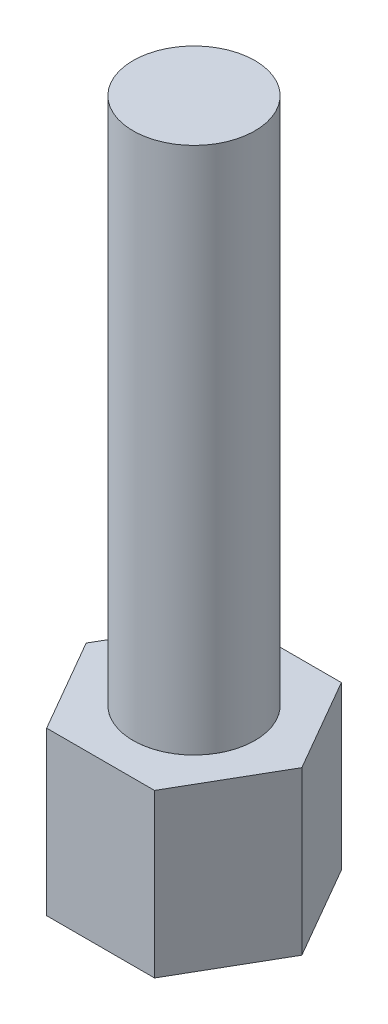
ISO-10303-21;
HEADER;
FILE_DESCRIPTION(('STEP AP214'),'2;1');
FILE_NAME('part.step','',(''),(''),'','','');
FILE_SCHEMA(('AUTOMOTIVE_DESIGN { 1 0 10303 214 1 1 1 1 }'));
ENDSEC;
DATA;
#1=APPLICATION_CONTEXT('core data for automotive mechanical design processes');
#2=APPLICATION_PROTOCOL_DEFINITION('international standard','automotive_design',2000,#1);
#3=PRODUCT_CONTEXT('',#1,'mechanical');
#4=PRODUCT('Part','Part','',(#3));
#5=PRODUCT_RELATED_PRODUCT_CATEGORY('part','',(#4));
#6=PRODUCT_DEFINITION_FORMATION('','',#4);
#7=PRODUCT_DEFINITION_CONTEXT('part definition',#1,'design');
#8=PRODUCT_DEFINITION('design','',#6,#7);
#9=PRODUCT_DEFINITION_SHAPE('','',#8);
#10=(LENGTH_UNIT() NAMED_UNIT(*) SI_UNIT(.MILLI.,.METRE.));
#11=(NAMED_UNIT(*) PLANE_ANGLE_UNIT() SI_UNIT($,.RADIAN.));
#12=(NAMED_UNIT(*) SI_UNIT($,.STERADIAN.) SOLID_ANGLE_UNIT());
#13=UNCERTAINTY_MEASURE_WITH_UNIT(LENGTH_MEASURE(1.E-05),#10,'distance_accuracy_value','');
#14=(GEOMETRIC_REPRESENTATION_CONTEXT(3) GLOBAL_UNCERTAINTY_ASSIGNED_CONTEXT((#13)) GLOBAL_UNIT_ASSIGNED_CONTEXT((#10,
#11,#12)) REPRESENTATION_CONTEXT('',''));
#15=CARTESIAN_POINT('',(0.,0.,0.));
#16=DIRECTION('',(0.,0.,1.));
#17=DIRECTION('',(1.,0.,0.));
#18=AXIS2_PLACEMENT_3D('',#15,#16,#17);
#19=CARTESIAN_POINT('',(1.32790561913614,4.,-2.3));
#20=DIRECTION('',(0.,0.,1.));
#21=DIRECTION('',(1.,0.,0.));
#22=AXIS2_PLACEMENT_3D('',#19,#20,#21);
#23=PLANE('',#22);
#24=DIRECTION('',(-1.,0.,0.));
#25=VECTOR('',#24,1.);
#26=CARTESIAN_POINT('',(1.32790561913614,0.,-2.3));
#27=LINE('',#26,#25);
#28=CARTESIAN_POINT('',(1.32790561913614,0.,-2.3));
#29=VERTEX_POINT('',#28);
#30=CARTESIAN_POINT('',(-1.32790561913614,0.,-2.3));
#31=VERTEX_POINT('',#30);
#32=EDGE_CURVE('E139',#29,#31,#27,.T.);
#33=ORIENTED_EDGE('',*,*,#32,.T.);
#34=DIRECTION('',(0.,-1.,0.));
#35=VECTOR('',#34,1.);
#36=CARTESIAN_POINT('',(-1.32790561913614,4.,-2.3));
#37=LINE('',#36,#35);
#38=CARTESIAN_POINT('',(-1.32790561913614,4.,-2.3));
#39=VERTEX_POINT('',#38);
#40=EDGE_CURVE('E123',#39,#31,#37,.T.);
#41=ORIENTED_EDGE('',*,*,#40,.F.);
#42=DIRECTION('',(-1.,0.,0.));
#43=VECTOR('',#42,1.);
#44=CARTESIAN_POINT('',(1.32790561913614,4.,-2.3));
#45=LINE('',#44,#43);
#46=CARTESIAN_POINT('',(1.32790561913614,4.,-2.3));
#47=VERTEX_POINT('',#46);
#48=EDGE_CURVE('E148',#47,#39,#45,.T.);
#49=ORIENTED_EDGE('',*,*,#48,.F.);
#50=DIRECTION('',(0.,-1.,0.));
#51=VECTOR('',#50,1.);
#52=CARTESIAN_POINT('',(1.32790561913614,4.,-2.3));
#53=LINE('',#52,#51);
#54=EDGE_CURVE('E125',#47,#29,#53,.T.);
#55=ORIENTED_EDGE('',*,*,#54,.T.);
#56=EDGE_LOOP('',(#33,#41,#49,#55));
#57=FACE_BOUND('',#56,.T.);
#58=ADVANCED_FACE('F55',(#57),#23,.F.);
#59=CARTESIAN_POINT('',(-1.32790561913614,4.,-2.3));
#60=DIRECTION('',(0.866025403784439,0.,0.499999999999999));
#61=DIRECTION('',(0.499999999999999,0.,-0.866025403784439));
#62=AXIS2_PLACEMENT_3D('',#59,#60,#61);
#63=PLANE('',#62);
#64=DIRECTION('',(-0.5,0.,0.866025403784439));
#65=VECTOR('',#64,1.);
#66=CARTESIAN_POINT('',(-1.32790561913614,0.,-2.3));
#67=LINE('',#66,#65);
#68=CARTESIAN_POINT('',(-2.65581123827228,0.,0.));
#69=VERTEX_POINT('',#68);
#70=EDGE_CURVE('E73',#31,#69,#67,.T.);
#71=ORIENTED_EDGE('',*,*,#70,.T.);
#72=DIRECTION('',(0.,-1.,0.));
#73=VECTOR('',#72,1.);
#74=CARTESIAN_POINT('',(-2.65581123827228,4.,0.));
#75=LINE('',#74,#73);
#76=CARTESIAN_POINT('',(-2.65581123827228,4.,0.));
#77=VERTEX_POINT('',#76);
#78=EDGE_CURVE('E120',#77,#69,#75,.T.);
#79=ORIENTED_EDGE('',*,*,#78,.F.);
#80=DIRECTION('',(-0.5,0.,0.866025403784439));
#81=VECTOR('',#80,1.);
#82=CARTESIAN_POINT('',(-1.32790561913614,4.,-2.3));
#83=LINE('',#82,#81);
#84=EDGE_CURVE('E95',#39,#77,#83,.T.);
#85=ORIENTED_EDGE('',*,*,#84,.F.);
#86=ORIENTED_EDGE('',*,*,#40,.T.);
#87=EDGE_LOOP('',(#71,#79,#85,#86));
#88=FACE_BOUND('',#87,.T.);
#89=ADVANCED_FACE('F119',(#88),#63,.F.);
#90=CARTESIAN_POINT('',(-2.65581123827228,4.,0.));
#91=DIRECTION('',(0.866025403784438,0.,-0.5));
#92=DIRECTION('',(-0.5,0.,-0.866025403784439));
#93=AXIS2_PLACEMENT_3D('',#90,#91,#92);
#94=PLANE('',#93);
#95=DIRECTION('',(0.5,0.,0.866025403784438));
#96=VECTOR('',#95,1.);
#97=CARTESIAN_POINT('',(-2.65581123827228,0.,0.));
#98=LINE('',#97,#96);
#99=CARTESIAN_POINT('',(-1.32790561913614,0.,2.3));
#100=VERTEX_POINT('',#99);
#101=EDGE_CURVE('E116',#69,#100,#98,.T.);
#102=ORIENTED_EDGE('',*,*,#101,.T.);
#103=DIRECTION('',(0.,-1.,0.));
#104=VECTOR('',#103,1.);
#105=CARTESIAN_POINT('',(-1.32790561913614,4.,2.3));
#106=LINE('',#105,#104);
#107=CARTESIAN_POINT('',(-1.32790561913614,4.,2.3));
#108=VERTEX_POINT('',#107);
#109=EDGE_CURVE('E163',#108,#100,#106,.T.);
#110=ORIENTED_EDGE('',*,*,#109,.F.);
#111=DIRECTION('',(0.5,0.,0.866025403784438));
#112=VECTOR('',#111,1.);
#113=CARTESIAN_POINT('',(-2.65581123827228,4.,0.));
#114=LINE('',#113,#112);
#115=EDGE_CURVE('E128',#77,#108,#114,.T.);
#116=ORIENTED_EDGE('',*,*,#115,.F.);
#117=ORIENTED_EDGE('',*,*,#78,.T.);
#118=EDGE_LOOP('',(#102,#110,#116,#117));
#119=FACE_BOUND('',#118,.T.);
#120=ADVANCED_FACE('F127',(#119),#94,.F.);
#121=CARTESIAN_POINT('',(-1.32790561913614,4.,2.3));
#122=DIRECTION('',(0.,0.,-1.));
#123=DIRECTION('',(-1.,0.,0.));
#124=AXIS2_PLACEMENT_3D('',#121,#122,#123);
#125=PLANE('',#124);
#126=DIRECTION('',(1.,0.,0.));
#127=VECTOR('',#126,1.);
#128=CARTESIAN_POINT('',(-1.32790561913614,0.,2.3));
#129=LINE('',#128,#127);
#130=CARTESIAN_POINT('',(1.32790561913614,0.,2.3));
#131=VERTEX_POINT('',#130);
#132=EDGE_CURVE('E129',#100,#131,#129,.T.);
#133=ORIENTED_EDGE('',*,*,#132,.T.);
#134=DIRECTION('',(0.,-1.,0.));
#135=VECTOR('',#134,1.);
#136=CARTESIAN_POINT('',(1.32790561913614,4.,2.3));
#137=LINE('',#136,#135);
#138=CARTESIAN_POINT('',(1.32790561913614,4.,2.3));
#139=VERTEX_POINT('',#138);
#140=EDGE_CURVE('E157',#139,#131,#137,.T.);
#141=ORIENTED_EDGE('',*,*,#140,.F.);
#142=DIRECTION('',(1.,0.,0.));
#143=VECTOR('',#142,1.);
#144=CARTESIAN_POINT('',(-1.32790561913614,4.,2.3));
#145=LINE('',#144,#143);
#146=EDGE_CURVE('E144',#108,#139,#145,.T.);
#147=ORIENTED_EDGE('',*,*,#146,.F.);
#148=ORIENTED_EDGE('',*,*,#109,.T.);
#149=EDGE_LOOP('',(#133,#141,#147,#148));
#150=FACE_BOUND('',#149,.T.);
#151=ADVANCED_FACE('F169',(#150),#125,.F.);
#152=CARTESIAN_POINT('',(1.32790561913614,4.,2.3));
#153=DIRECTION('',(-0.866025403784439,0.,-0.5));
#154=DIRECTION('',(-0.5,0.,0.866025403784439));
#155=AXIS2_PLACEMENT_3D('',#152,#153,#154);
#156=PLANE('',#155);
#157=DIRECTION('',(0.5,0.,-0.866025403784439));
#158=VECTOR('',#157,1.);
#159=CARTESIAN_POINT('',(1.32790561913614,0.,2.3));
#160=LINE('',#159,#158);
#161=CARTESIAN_POINT('',(2.65581123827228,0.,0.));
#162=VERTEX_POINT('',#161);
#163=EDGE_CURVE('E162',#131,#162,#160,.T.);
#164=ORIENTED_EDGE('',*,*,#163,.T.);
#165=DIRECTION('',(0.,-1.,0.));
#166=VECTOR('',#165,1.);
#167=CARTESIAN_POINT('',(2.65581123827228,4.,0.));
#168=LINE('',#167,#166);
#169=CARTESIAN_POINT('',(2.65581123827228,4.,0.));
#170=VERTEX_POINT('',#169);
#171=EDGE_CURVE('E151',#170,#162,#168,.T.);
#172=ORIENTED_EDGE('',*,*,#171,.F.);
#173=DIRECTION('',(0.5,0.,-0.866025403784439));
#174=VECTOR('',#173,1.);
#175=CARTESIAN_POINT('',(1.32790561913614,4.,2.3));
#176=LINE('',#175,#174);
#177=EDGE_CURVE('E142',#139,#170,#176,.T.);
#178=ORIENTED_EDGE('',*,*,#177,.F.);
#179=ORIENTED_EDGE('',*,*,#140,.T.);
#180=EDGE_LOOP('',(#164,#172,#178,#179));
#181=FACE_BOUND('',#180,.T.);
#182=ADVANCED_FACE('F171',(#181),#156,.F.);
#183=CARTESIAN_POINT('',(2.65581123827228,4.,0.));
#184=DIRECTION('',(-0.866025403784438,0.,0.5));
#185=DIRECTION('',(0.5,0.,0.866025403784438));
#186=AXIS2_PLACEMENT_3D('',#183,#184,#185);
#187=PLANE('',#186);
#188=DIRECTION('',(-0.5,0.,-0.866025403784438));
#189=VECTOR('',#188,1.);
#190=CARTESIAN_POINT('',(2.65581123827228,0.,0.));
#191=LINE('',#190,#189);
#192=EDGE_CURVE('E104',#162,#29,#191,.T.);
#193=ORIENTED_EDGE('',*,*,#192,.T.);
#194=ORIENTED_EDGE('',*,*,#54,.F.);
#195=DIRECTION('',(-0.5,0.,-0.866025403784438));
#196=VECTOR('',#195,1.);
#197=CARTESIAN_POINT('',(2.65581123827228,4.,0.));
#198=LINE('',#197,#196);
#199=EDGE_CURVE('E65',#170,#47,#198,.T.);
#200=ORIENTED_EDGE('',*,*,#199,.F.);
#201=ORIENTED_EDGE('',*,*,#171,.T.);
#202=EDGE_LOOP('',(#193,#194,#200,#201));
#203=FACE_BOUND('',#202,.T.);
#204=ADVANCED_FACE('F173',(#203),#187,.F.);
#205=CARTESIAN_POINT('',(0.,4.,0.));
#206=DIRECTION('',(0.,1.,0.));
#207=DIRECTION('',(0.,0.,1.));
#208=AXIS2_PLACEMENT_3D('',#205,#206,#207);
#209=PLANE('',#208);
#210=CARTESIAN_POINT('',(0.,4.,0.));
#211=DIRECTION('',(0.,1.,0.));
#212=DIRECTION('',(0.,0.,1.));
#213=AXIS2_PLACEMENT_3D('',#210,#211,#212);
#214=CIRCLE('',#213,1.5);
#215=CARTESIAN_POINT('',(0.,4.,1.5));
#216=VERTEX_POINT('',#215);
#217=EDGE_CURVE('E59',#216,#216,#214,.F.);
#218=ORIENTED_EDGE('',*,*,#217,.T.);
#219=EDGE_LOOP('',(#218));
#220=FACE_BOUND('',#219,.T.);
#221=ORIENTED_EDGE('',*,*,#48,.T.);
#222=ORIENTED_EDGE('',*,*,#84,.T.);
#223=ORIENTED_EDGE('',*,*,#115,.T.);
#224=ORIENTED_EDGE('',*,*,#146,.T.);
#225=ORIENTED_EDGE('',*,*,#177,.T.);
#226=ORIENTED_EDGE('',*,*,#199,.T.);
#227=EDGE_LOOP('',(#221,#222,#223,#224,#225,#226));
#228=FACE_BOUND('',#227,.T.);
#229=ADVANCED_FACE('F174',(#220,#228),#209,.T.);
#230=CARTESIAN_POINT('',(0.,0.,0.));
#231=DIRECTION('',(0.,1.,0.));
#232=DIRECTION('',(0.,0.,1.));
#233=AXIS2_PLACEMENT_3D('',#230,#231,#232);
#234=PLANE('',#233);
#235=CARTESIAN_POINT('',(0.,0.,0.));
#236=DIRECTION('',(0.,-1.,0.));
#237=DIRECTION('',(0.,0.,-1.));
#238=AXIS2_PLACEMENT_3D('',#235,#236,#237);
#239=CIRCLE('',#238,1.5);
#240=CARTESIAN_POINT('',(0.,0.,-1.5));
#241=VERTEX_POINT('',#240);
#242=EDGE_CURVE('E12',#241,#241,#239,.T.);
#243=ORIENTED_EDGE('',*,*,#242,.F.);
#244=EDGE_LOOP('',(#243));
#245=FACE_BOUND('',#244,.T.);
#246=ORIENTED_EDGE('',*,*,#32,.F.);
#247=ORIENTED_EDGE('',*,*,#192,.F.);
#248=ORIENTED_EDGE('',*,*,#163,.F.);
#249=ORIENTED_EDGE('',*,*,#132,.F.);
#250=ORIENTED_EDGE('',*,*,#101,.F.);
#251=ORIENTED_EDGE('',*,*,#70,.F.);
#252=EDGE_LOOP('',(#246,#247,#248,#249,#250,#251));
#253=FACE_BOUND('',#252,.T.);
#254=ADVANCED_FACE('F132',(#245,#253),#234,.F.);
#255=CARTESIAN_POINT('',(0.,8.24264068711929,0.));
#256=DIRECTION('',(0.,-1.,0.));
#257=DIRECTION('',(0.,0.,-1.));
#258=AXIS2_PLACEMENT_3D('',#255,#256,#257);
#259=CYLINDRICAL_SURFACE('',#258,1.5);
#260=ORIENTED_EDGE('',*,*,#242,.T.);
#261=EDGE_LOOP('',(#260));
#262=FACE_BOUND('',#261,.T.);
#263=ORIENTED_EDGE('',*,*,#217,.F.);
#264=EDGE_LOOP('',(#263));
#265=FACE_BOUND('',#264,.T.);
#266=ADVANCED_FACE('F57',(#262,#265),#259,.F.);
#267=CLOSED_SHELL('',(#58,#89,#120,#151,#182,#204,#229,#254,#266));
#268=MANIFOLD_SOLID_BREP('B2',#267);
#269=CARTESIAN_POINT('',(0.,17.,0.));
#270=DIRECTION('',(0.,1.,0.));
#271=DIRECTION('',(0.,0.,1.));
#272=AXIS2_PLACEMENT_3D('',#269,#270,#271);
#273=PLANE('',#272);
#274=CARTESIAN_POINT('',(0.,17.,0.));
#275=DIRECTION('',(0.,1.,0.));
#276=DIRECTION('',(0.,0.,1.));
#277=AXIS2_PLACEMENT_3D('',#274,#275,#276);
#278=CIRCLE('',#277,1.5);
#279=CARTESIAN_POINT('',(0.,17.,-1.5));
#280=VERTEX_POINT('',#279);
#281=EDGE_CURVE('E54',#280,#280,#278,.T.);
#282=ORIENTED_EDGE('',*,*,#281,.T.);
#283=EDGE_LOOP('',(#282));
#284=FACE_BOUND('',#283,.T.);
#285=ADVANCED_FACE('F278',(#284),#273,.T.);
#286=CARTESIAN_POINT('',(0.,17.,0.));
#287=DIRECTION('',(0.,-1.,0.));
#288=DIRECTION('',(0.,0.,-1.));
#289=AXIS2_PLACEMENT_3D('',#286,#287,#288);
#290=CYLINDRICAL_SURFACE('',#289,1.5);
#291=CARTESIAN_POINT('',(0.,4.,0.));
#292=DIRECTION('',(0.,1.,0.));
#293=DIRECTION('',(0.,0.,1.));
#294=AXIS2_PLACEMENT_3D('',#291,#292,#293);
#295=CIRCLE('',#294,1.5);
#296=CARTESIAN_POINT('',(0.,4.,-1.5));
#297=VERTEX_POINT('',#296);
#298=EDGE_CURVE('E285',#297,#297,#295,.F.);
#299=CARTESIAN_POINT('',(0.,17.,-1.5));
#300=CARTESIAN_POINT('',(0.,16.8645833333333,-1.5));
#301=CARTESIAN_POINT('',(0.,16.7291666666667,-1.5));
#302=CARTESIAN_POINT('',(0.,16.4583333333333,-1.5));
#303=CARTESIAN_POINT('',(0.,16.3229166666667,-1.5));
#304=CARTESIAN_POINT('',(0.,16.0520833333333,-1.5));
#305=CARTESIAN_POINT('',(0.,15.9166666666667,-1.5));
#306=CARTESIAN_POINT('',(0.,15.6458333333333,-1.5));
#307=CARTESIAN_POINT('',(0.,15.5104166666667,-1.5));
#308=CARTESIAN_POINT('',(0.,15.2395833333333,-1.5));
#309=CARTESIAN_POINT('',(0.,15.1041666666667,-1.5));
#310=CARTESIAN_POINT('',(0.,14.8333333333333,-1.5));
#311=CARTESIAN_POINT('',(0.,14.6979166666667,-1.5));
#312=CARTESIAN_POINT('',(0.,14.4270833333333,-1.5));
#313=CARTESIAN_POINT('',(0.,14.2916666666667,-1.5));
#314=CARTESIAN_POINT('',(0.,14.0208333333333,-1.5));
#315=CARTESIAN_POINT('',(0.,13.8854166666667,-1.5));
#316=CARTESIAN_POINT('',(0.,13.6145833333333,-1.5));
#317=CARTESIAN_POINT('',(0.,13.4791666666667,-1.5));
#318=CARTESIAN_POINT('',(0.,13.2083333333333,-1.5));
#319=CARTESIAN_POINT('',(0.,13.0729166666667,-1.5));
#320=CARTESIAN_POINT('',(0.,12.8020833333333,-1.5));
#321=CARTESIAN_POINT('',(0.,12.6666666666667,-1.5));
#322=CARTESIAN_POINT('',(0.,12.3958333333333,-1.5));
#323=CARTESIAN_POINT('',(0.,12.2604166666667,-1.5));
#324=CARTESIAN_POINT('',(0.,11.9895833333333,-1.5));
#325=CARTESIAN_POINT('',(0.,11.8541666666667,-1.5));
#326=CARTESIAN_POINT('',(0.,11.5833333333333,-1.5));
#327=CARTESIAN_POINT('',(0.,11.4479166666667,-1.5));
#328=CARTESIAN_POINT('',(0.,11.1770833333333,-1.5));
#329=CARTESIAN_POINT('',(0.,11.0416666666667,-1.5));
#330=CARTESIAN_POINT('',(0.,10.7708333333333,-1.5));
#331=CARTESIAN_POINT('',(0.,10.6354166666667,-1.5));
#332=CARTESIAN_POINT('',(0.,10.3645833333333,-1.5));
#333=CARTESIAN_POINT('',(0.,10.2291666666667,-1.5));
#334=CARTESIAN_POINT('',(0.,9.95833333333333,-1.5));
#335=CARTESIAN_POINT('',(0.,9.82291666666667,-1.5));
#336=CARTESIAN_POINT('',(0.,9.55208333333333,-1.5));
#337=CARTESIAN_POINT('',(0.,9.41666666666667,-1.5));
#338=CARTESIAN_POINT('',(0.,9.14583333333333,-1.5));
#339=CARTESIAN_POINT('',(0.,9.01041666666666,-1.5));
#340=CARTESIAN_POINT('',(0.,8.73958333333333,-1.5));
#341=CARTESIAN_POINT('',(0.,8.60416666666667,-1.5));
#342=CARTESIAN_POINT('',(0.,8.33333333333333,-1.5));
#343=CARTESIAN_POINT('',(0.,8.19791666666667,-1.5));
#344=CARTESIAN_POINT('',(0.,7.92708333333333,-1.5));
#345=CARTESIAN_POINT('',(0.,7.79166666666667,-1.5));
#346=CARTESIAN_POINT('',(0.,7.52083333333333,-1.5));
#347=CARTESIAN_POINT('',(0.,7.38541666666667,-1.5));
#348=CARTESIAN_POINT('',(0.,7.11458333333333,-1.5));
#349=CARTESIAN_POINT('',(0.,6.97916666666667,-1.5));
#350=CARTESIAN_POINT('',(0.,6.70833333333333,-1.5));
#351=CARTESIAN_POINT('',(0.,6.57291666666667,-1.5));
#352=CARTESIAN_POINT('',(0.,6.30208333333333,-1.5));
#353=CARTESIAN_POINT('',(0.,6.16666666666667,-1.5));
#354=CARTESIAN_POINT('',(0.,5.89583333333333,-1.5));
#355=CARTESIAN_POINT('',(0.,5.76041666666666,-1.5));
#356=CARTESIAN_POINT('',(0.,5.48958333333333,-1.5));
#357=CARTESIAN_POINT('',(0.,5.35416666666667,-1.5));
#358=CARTESIAN_POINT('',(0.,5.08333333333333,-1.5));
#359=CARTESIAN_POINT('',(0.,4.94791666666667,-1.5));
#360=CARTESIAN_POINT('',(0.,4.67708333333333,-1.5));
#361=CARTESIAN_POINT('',(0.,4.54166666666667,-1.5));
#362=CARTESIAN_POINT('',(0.,4.27083333333333,-1.5));
#363=CARTESIAN_POINT('',(0.,4.13541666666667,-1.5));
#364=CARTESIAN_POINT('',(0.,4.,-1.5));
#365=B_SPLINE_CURVE_WITH_KNOTS('',3,(#299,#300,#301,#302,#303,#304,#305,#306,#307,#308,#309,
#310,#311,#312,#313,#314,#315,#316,#317,#318,#319,#320,#321,#322,#323,#324,#325,#326,#327,#328,
#329,#330,#331,#332,#333,#334,#335,#336,#337,#338,#339,#340,#341,#342,#343,#344,#345,#346,#347,
#348,#349,#350,#351,#352,#353,#354,#355,#356,#357,#358,#359,#360,#361,#362,#363,#364),
.UNSPECIFIED.,.F.,.F.,(4,2,2,2,2,2,2,2,2,2,2,2,2,2,2,2,2,2,2,2,2,2,2,2,2,2,2,2,2,2,2,2,4),(0.,
0.406249999999997,0.812499999999997,1.21875,1.625,2.03125,2.4375,2.84375,3.25,3.65625,4.0625,
4.46875,4.875,5.28125,5.6875,6.09375,6.5,6.90625,7.3125,7.71875,8.125,8.53125,8.9375,9.34375,
9.75,10.15625,10.5625,10.96875,11.375,11.78125,12.1875,12.59375,13.),.UNSPECIFIED.);
#366=EDGE_CURVE('BSEAM280',#280,#297,#365,.T.);
#367=ORIENTED_EDGE('',*,*,#281,.F.);
#368=ORIENTED_EDGE('',*,*,#298,.F.);
#369=ORIENTED_EDGE('',*,*,#366,.T.);
#370=ORIENTED_EDGE('',*,*,#366,.F.);
#371=EDGE_LOOP('',(#367,#369,#368,#370));
#372=FACE_BOUND('',#371,.T.);
#373=ADVANCED_FACE('F280',(#372),#290,.T.);
#374=CARTESIAN_POINT('',(0.,4.,0.));
#375=DIRECTION('',(0.,1.,0.));
#376=DIRECTION('',(0.,0.,1.));
#377=AXIS2_PLACEMENT_3D('',#374,#375,#376);
#378=PLANE('',#377);
#379=ORIENTED_EDGE('',*,*,#298,.T.);
#380=EDGE_LOOP('',(#379));
#381=FACE_BOUND('',#380,.T.);
#382=ADVANCED_FACE('F291',(#381),#378,.F.);
#383=CLOSED_SHELL('',(#285,#373,#382));
#384=MANIFOLD_SOLID_BREP('B6',#383);
#385=ADVANCED_BREP_SHAPE_REPRESENTATION('',(#18,#268,#384),#14);
#386=SHAPE_DEFINITION_REPRESENTATION(#9,#385);
ENDSEC;
END-ISO-10303-21;
